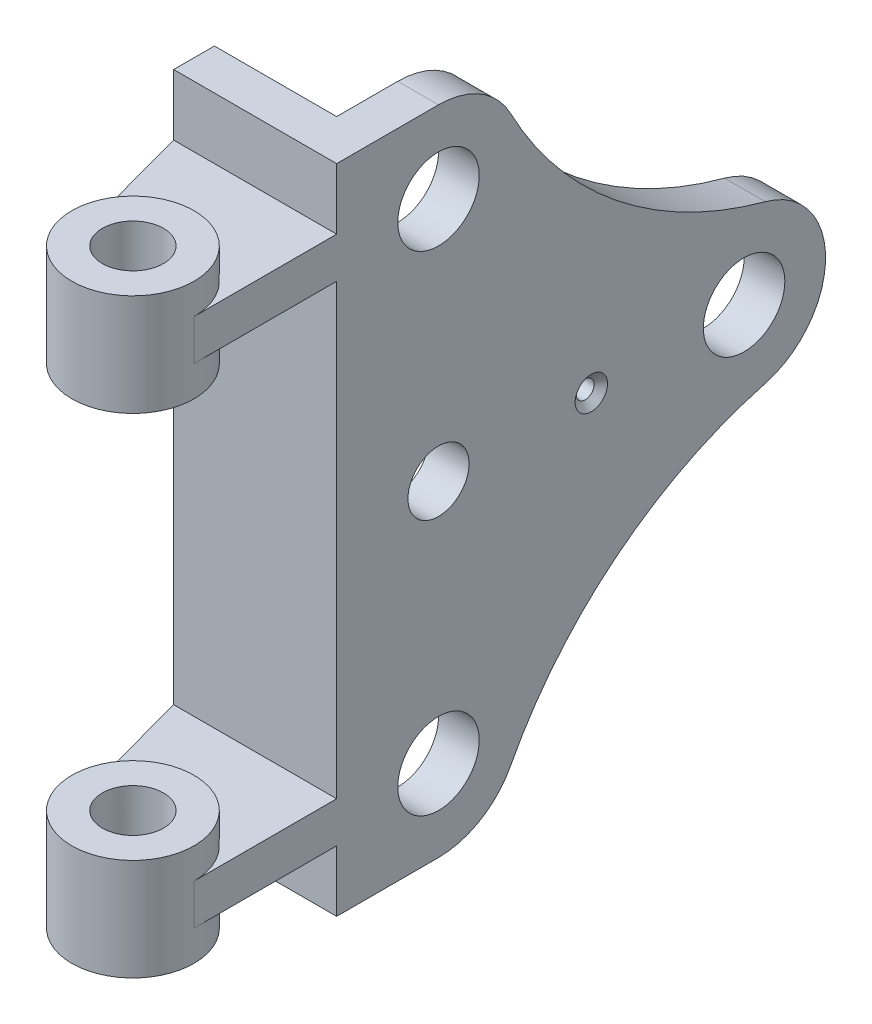
ISO-10303-21;
HEADER;
FILE_DESCRIPTION(('STEP AP214'),'2;1');
FILE_NAME('part.step','',(''),(''),'','','');
FILE_SCHEMA(('AUTOMOTIVE_DESIGN { 1 0 10303 214 1 1 1 1 }'));
ENDSEC;
DATA;
#1=APPLICATION_CONTEXT('core data for automotive mechanical design processes');
#2=APPLICATION_PROTOCOL_DEFINITION('international standard','automotive_design',2000,#1);
#3=PRODUCT_CONTEXT('',#1,'mechanical');
#4=PRODUCT('Part','Part','',(#3));
#5=PRODUCT_RELATED_PRODUCT_CATEGORY('part','',(#4));
#6=PRODUCT_DEFINITION_FORMATION('','',#4);
#7=PRODUCT_DEFINITION_CONTEXT('part definition',#1,'design');
#8=PRODUCT_DEFINITION('design','',#6,#7);
#9=PRODUCT_DEFINITION_SHAPE('','',#8);
#10=(LENGTH_UNIT() NAMED_UNIT(*) SI_UNIT(.MILLI.,.METRE.));
#11=(NAMED_UNIT(*) PLANE_ANGLE_UNIT() SI_UNIT($,.RADIAN.));
#12=(NAMED_UNIT(*) SI_UNIT($,.STERADIAN.) SOLID_ANGLE_UNIT());
#13=UNCERTAINTY_MEASURE_WITH_UNIT(LENGTH_MEASURE(1.E-05),#10,'distance_accuracy_value','');
#14=(GEOMETRIC_REPRESENTATION_CONTEXT(3) GLOBAL_UNCERTAINTY_ASSIGNED_CONTEXT((#13)) GLOBAL_UNIT_ASSIGNED_CONTEXT((#10,
#11,#12)) REPRESENTATION_CONTEXT('',''));
#15=CARTESIAN_POINT('',(0.,0.,0.));
#16=DIRECTION('',(0.,0.,1.));
#17=DIRECTION('',(1.,0.,0.));
#18=AXIS2_PLACEMENT_3D('',#15,#16,#17);
#19=CARTESIAN_POINT('',(-3.175,20.6375,22.225));
#20=DIRECTION('',(0.,-1.,0.));
#21=DIRECTION('',(0.,0.,1.));
#22=AXIS2_PLACEMENT_3D('',#19,#20,#21);
#23=PLANE('',#22);
#24=CARTESIAN_POINT('',(-3.175,20.6375,22.225));
#25=DIRECTION('',(0.,1.,0.));
#26=DIRECTION('',(0.,0.,1.));
#27=AXIS2_PLACEMENT_3D('',#24,#25,#26);
#28=CIRCLE('',#27,9.525);
#29=CARTESIAN_POINT('',(-3.175,20.6375,31.75));
#30=VERTEX_POINT('',#29);
#31=EDGE_CURVE('E183',#30,#30,#28,.T.);
#32=ORIENTED_EDGE('',*,*,#31,.T.);
#33=EDGE_LOOP('',(#32));
#34=FACE_BOUND('',#33,.T.);
#35=CARTESIAN_POINT('',(-3.175,20.6375,22.225));
#36=DIRECTION('',(0.,-1.,0.));
#37=DIRECTION('',(0.,0.,-1.));
#38=AXIS2_PLACEMENT_3D('',#35,#36,#37);
#39=CIRCLE('',#38,4.7625);
#40=CARTESIAN_POINT('',(-3.175,20.6375,17.4625));
#41=VERTEX_POINT('',#40);
#42=EDGE_CURVE('E180',#41,#41,#39,.F.);
#43=ORIENTED_EDGE('',*,*,#42,.F.);
#44=EDGE_LOOP('',(#43));
#45=FACE_BOUND('',#44,.T.);
#46=ADVANCED_FACE('F32',(#34,#45),#23,.F.);
#47=CARTESIAN_POINT('',(-3.175,4.7625,22.225));
#48=DIRECTION('',(0.,-1.,0.));
#49=DIRECTION('',(0.,0.,1.));
#50=AXIS2_PLACEMENT_3D('',#47,#48,#49);
#51=PLANE('',#50);
#52=CARTESIAN_POINT('',(-3.175,4.7625,22.225));
#53=DIRECTION('',(0.,1.,0.));
#54=DIRECTION('',(0.,0.,1.));
#55=AXIS2_PLACEMENT_3D('',#52,#53,#54);
#56=CIRCLE('',#55,9.525);
#57=CARTESIAN_POINT('',(-3.175,4.7625,31.75));
#58=VERTEX_POINT('',#57);
#59=EDGE_CURVE('E184',#58,#58,#56,.T.);
#60=ORIENTED_EDGE('',*,*,#59,.F.);
#61=EDGE_LOOP('',(#60));
#62=FACE_BOUND('',#61,.T.);
#63=CARTESIAN_POINT('',(-3.175,4.7625,22.225));
#64=DIRECTION('',(0.,1.,0.));
#65=DIRECTION('',(0.,0.,1.));
#66=AXIS2_PLACEMENT_3D('',#63,#64,#65);
#67=CIRCLE('',#66,4.7625);
#68=CARTESIAN_POINT('',(-3.175,4.7625,26.9875));
#69=VERTEX_POINT('',#68);
#70=EDGE_CURVE('E177',#69,#69,#67,.T.);
#71=ORIENTED_EDGE('',*,*,#70,.T.);
#72=EDGE_LOOP('',(#71));
#73=FACE_BOUND('',#72,.T.);
#74=ADVANCED_FACE('F439',(#62,#73),#51,.T.);
#75=CARTESIAN_POINT('',(6.35,0.,0.));
#76=DIRECTION('',(0.,0.,-1.));
#77=DIRECTION('',(-1.,0.,0.));
#78=AXIS2_PLACEMENT_3D('',#75,#76,#77);
#79=PLANE('',#78);
#80=DIRECTION('',(-1.,0.,0.));
#81=VECTOR('',#80,1.);
#82=CARTESIAN_POINT('',(-19.05,9.525,0.));
#83=LINE('',#82,#81);
#84=CARTESIAN_POINT('',(6.35,9.525,0.));
#85=VERTEX_POINT('',#84);
#86=CARTESIAN_POINT('',(-19.05,9.525,0.));
#87=VERTEX_POINT('',#86);
#88=EDGE_CURVE('E195',#85,#87,#83,.T.);
#89=ORIENTED_EDGE('',*,*,#88,.T.);
#90=DIRECTION('',(0.,-1.,0.));
#91=VECTOR('',#90,1.);
#92=CARTESIAN_POINT('',(-19.05,0.,0.));
#93=LINE('',#92,#91);
#94=CARTESIAN_POINT('',(-19.05,0.,0.));
#95=VERTEX_POINT('',#94);
#96=EDGE_CURVE('E270',#87,#95,#93,.T.);
#97=ORIENTED_EDGE('',*,*,#96,.T.);
#98=DIRECTION('',(-1.,0.,0.));
#99=VECTOR('',#98,1.);
#100=CARTESIAN_POINT('',(6.35,0.,0.));
#101=LINE('',#100,#99);
#102=CARTESIAN_POINT('',(6.35,0.,0.));
#103=VERTEX_POINT('',#102);
#104=EDGE_CURVE('E309',#103,#95,#101,.T.);
#105=ORIENTED_EDGE('',*,*,#104,.F.);
#106=DIRECTION('',(0.,-1.,0.));
#107=VECTOR('',#106,1.);
#108=CARTESIAN_POINT('',(6.35,0.,0.));
#109=LINE('',#108,#107);
#110=EDGE_CURVE('E47',#85,#103,#109,.T.);
#111=ORIENTED_EDGE('',*,*,#110,.F.);
#112=EDGE_LOOP('',(#89,#97,#105,#111));
#113=FACE_BOUND('',#112,.T.);
#114=ADVANCED_FACE('F445',(#113),#79,.F.);
#115=CARTESIAN_POINT('',(-3.175,92.075,22.225));
#116=DIRECTION('',(0.,-1.,0.));
#117=DIRECTION('',(0.,0.,-1.));
#118=AXIS2_PLACEMENT_3D('',#115,#116,#117);
#119=PLANE('',#118);
#120=CARTESIAN_POINT('',(-3.175,92.075,22.225));
#121=DIRECTION('',(0.,-1.,0.));
#122=DIRECTION('',(0.,0.,-1.));
#123=AXIS2_PLACEMENT_3D('',#120,#121,#122);
#124=CIRCLE('',#123,9.525);
#125=CARTESIAN_POINT('',(6.35,92.075,22.225));
#126=VERTEX_POINT('',#125);
#127=CARTESIAN_POINT('',(-12.3699464238893,92.075,24.7106760170638));
#128=VERTEX_POINT('',#127);
#129=EDGE_CURVE('E223',#126,#128,#124,.F.);
#130=ORIENTED_EDGE('',*,*,#129,.F.);
#131=DIRECTION('',(0.,0.,-1.));
#132=VECTOR('',#131,1.);
#133=CARTESIAN_POINT('',(6.35,92.075,0.));
#134=LINE('',#133,#132);
#135=CARTESIAN_POINT('',(6.35,92.075,0.));
#136=VERTEX_POINT('',#135);
#137=EDGE_CURVE('E239',#126,#136,#134,.T.);
#138=ORIENTED_EDGE('',*,*,#137,.T.);
#139=DIRECTION('',(-1.,0.,0.));
#140=VECTOR('',#139,1.);
#141=CARTESIAN_POINT('',(-19.05,92.075,0.));
#142=LINE('',#141,#140);
#143=CARTESIAN_POINT('',(-19.05,92.075,0.));
#144=VERTEX_POINT('',#143);
#145=EDGE_CURVE('E234',#136,#144,#142,.T.);
#146=ORIENTED_EDGE('',*,*,#145,.T.);
#147=DIRECTION('',(0.260963361371523,0.,0.965348705920133));
#148=VECTOR('',#147,1.);
#149=CARTESIAN_POINT('',(-12.3699464238893,92.075,24.7106760170638));
#150=LINE('',#149,#148);
#151=EDGE_CURVE('E248',#144,#128,#150,.T.);
#152=ORIENTED_EDGE('',*,*,#151,.T.);
#153=EDGE_LOOP('',(#130,#138,#146,#152));
#154=FACE_BOUND('',#153,.T.);
#155=ADVANCED_FACE('F413',(#154),#119,.F.);
#156=CARTESIAN_POINT('',(-3.175,85.725,22.225));
#157=DIRECTION('',(0.,-1.,0.));
#158=DIRECTION('',(0.,0.,-1.));
#159=AXIS2_PLACEMENT_3D('',#156,#157,#158);
#160=PLANE('',#159);
#161=DIRECTION('',(0.,0.,-1.));
#162=VECTOR('',#161,1.);
#163=CARTESIAN_POINT('',(6.35,85.725,0.));
#164=LINE('',#163,#162);
#165=CARTESIAN_POINT('',(6.35,85.725,22.225));
#166=VERTEX_POINT('',#165);
#167=CARTESIAN_POINT('',(6.35,85.725,0.));
#168=VERTEX_POINT('',#167);
#169=EDGE_CURVE('E258',#166,#168,#164,.T.);
#170=ORIENTED_EDGE('',*,*,#169,.F.);
#171=CARTESIAN_POINT('',(-3.175,85.725,22.225));
#172=DIRECTION('',(0.,-1.,0.));
#173=DIRECTION('',(0.,0.,-1.));
#174=AXIS2_PLACEMENT_3D('',#171,#172,#173);
#175=CIRCLE('',#174,9.525);
#176=CARTESIAN_POINT('',(-12.3699464238893,85.725,24.7106760170638));
#177=VERTEX_POINT('',#176);
#178=EDGE_CURVE('E40',#166,#177,#175,.F.);
#179=ORIENTED_EDGE('',*,*,#178,.T.);
#180=DIRECTION('',(0.260963361371523,0.,0.965348705920133));
#181=VECTOR('',#180,1.);
#182=CARTESIAN_POINT('',(-12.3699464238893,85.725,24.7106760170638));
#183=LINE('',#182,#181);
#184=CARTESIAN_POINT('',(-19.05,85.7249999999999,0.));
#185=VERTEX_POINT('',#184);
#186=EDGE_CURVE('E228',#185,#177,#183,.T.);
#187=ORIENTED_EDGE('',*,*,#186,.F.);
#188=DIRECTION('',(-1.,0.,0.));
#189=VECTOR('',#188,1.);
#190=CARTESIAN_POINT('',(-19.05,85.725,0.));
#191=LINE('',#190,#189);
#192=EDGE_CURVE('E251',#168,#185,#191,.T.);
#193=ORIENTED_EDGE('',*,*,#192,.F.);
#194=EDGE_LOOP('',(#170,#179,#187,#193));
#195=FACE_BOUND('',#194,.T.);
#196=ADVANCED_FACE('F401',(#195),#160,.T.);
#197=ORIENTED_EDGE('',*,*,#145,.F.);
#198=CARTESIAN_POINT('',(6.35,101.6,0.));
#199=VERTEX_POINT('',#198);
#200=EDGE_CURVE('E312',#199,#136,#109,.T.);
#201=ORIENTED_EDGE('',*,*,#200,.F.);
#202=DIRECTION('',(-1.,0.,0.));
#203=VECTOR('',#202,1.);
#204=CARTESIAN_POINT('',(6.35,101.6,0.));
#205=LINE('',#204,#203);
#206=CARTESIAN_POINT('',(-19.05,101.6,0.));
#207=VERTEX_POINT('',#206);
#208=EDGE_CURVE('E307',#199,#207,#205,.T.);
#209=ORIENTED_EDGE('',*,*,#208,.T.);
#210=EDGE_CURVE('E285',#207,#144,#93,.T.);
#211=ORIENTED_EDGE('',*,*,#210,.T.);
#212=EDGE_LOOP('',(#197,#201,#209,#211));
#213=FACE_BOUND('',#212,.T.);
#214=ADVANCED_FACE('F502',(#213),#79,.F.);
#215=CARTESIAN_POINT('',(0.,12.7,-15.875));
#216=DIRECTION('',(1.,0.,0.));
#217=DIRECTION('',(0.,0.,-1.));
#218=AXIS2_PLACEMENT_3D('',#215,#216,#217);
#219=PLANE('',#218);
#220=CARTESIAN_POINT('',(0.,50.8,-63.5));
#221=DIRECTION('',(1.,0.,0.));
#222=DIRECTION('',(0.,0.,-1.));
#223=AXIS2_PLACEMENT_3D('',#220,#221,#222);
#224=CIRCLE('',#223,6.35);
#225=CARTESIAN_POINT('',(0.,50.8,-69.85));
#226=VERTEX_POINT('',#225);
#227=EDGE_CURVE('E328',#226,#226,#224,.T.);
#228=ORIENTED_EDGE('',*,*,#227,.T.);
#229=EDGE_LOOP('',(#228));
#230=FACE_BOUND('',#229,.T.);
#231=CARTESIAN_POINT('',(0.,88.9,-15.875));
#232=DIRECTION('',(1.,0.,0.));
#233=DIRECTION('',(0.,0.,-1.));
#234=AXIS2_PLACEMENT_3D('',#231,#232,#233);
#235=CIRCLE('',#234,6.35);
#236=CARTESIAN_POINT('',(0.,88.9,-22.225));
#237=VERTEX_POINT('',#236);
#238=EDGE_CURVE('E357',#237,#237,#235,.T.);
#239=ORIENTED_EDGE('',*,*,#238,.T.);
#240=EDGE_LOOP('',(#239));
#241=FACE_BOUND('',#240,.T.);
#242=CARTESIAN_POINT('',(0.,12.7,-15.875));
#243=DIRECTION('',(1.,0.,0.));
#244=DIRECTION('',(0.,0.,-1.));
#245=AXIS2_PLACEMENT_3D('',#242,#243,#244);
#246=CIRCLE('',#245,6.35);
#247=CARTESIAN_POINT('',(0.,12.7,-22.225));
#248=VERTEX_POINT('',#247);
#249=EDGE_CURVE('E363',#248,#248,#246,.T.);
#250=ORIENTED_EDGE('',*,*,#249,.T.);
#251=EDGE_LOOP('',(#250));
#252=FACE_BOUND('',#251,.T.);
#253=CARTESIAN_POINT('',(0.,50.8,-15.875));
#254=DIRECTION('',(1.,0.,0.));
#255=DIRECTION('',(0.,0.,-1.));
#256=AXIS2_PLACEMENT_3D('',#253,#254,#255);
#257=CIRCLE('',#256,4.7625);
#258=CARTESIAN_POINT('',(0.,50.8,-20.6375));
#259=VERTEX_POINT('',#258);
#260=EDGE_CURVE('E369',#259,#259,#257,.T.);
#261=ORIENTED_EDGE('',*,*,#260,.T.);
#262=EDGE_LOOP('',(#261));
#263=FACE_BOUND('',#262,.T.);
#264=DIRECTION('',(0.,-1.,0.));
#265=VECTOR('',#264,1.);
#266=CARTESIAN_POINT('',(0.,12.7,-6.35));
#267=LINE('',#266,#265);
#268=CARTESIAN_POINT('',(0.,101.6,-6.35));
#269=VERTEX_POINT('',#268);
#270=CARTESIAN_POINT('',(0.,0.,-6.35));
#271=VERTEX_POINT('',#270);
#272=EDGE_CURVE('E269',#269,#271,#267,.T.);
#273=ORIENTED_EDGE('',*,*,#272,.F.);
#274=DIRECTION('',(0.,0.,1.));
#275=VECTOR('',#274,1.);
#276=CARTESIAN_POINT('',(0.,101.6,0.));
#277=LINE('',#276,#275);
#278=CARTESIAN_POINT('',(0.,101.6,-15.875));
#279=VERTEX_POINT('',#278);
#280=EDGE_CURVE('E313',#279,#269,#277,.T.);
#281=ORIENTED_EDGE('',*,*,#280,.F.);
#282=CARTESIAN_POINT('',(0.,88.9,-15.875));
#283=DIRECTION('',(1.,0.,0.));
#284=DIRECTION('',(0.,0.,1.));
#285=AXIS2_PLACEMENT_3D('',#282,#283,#284);
#286=CIRCLE('',#285,12.7);
#287=CARTESIAN_POINT('',(0.,94.8132663040378,-27.1143630432303));
#288=VERTEX_POINT('',#287);
#289=EDGE_CURVE('E317',#288,#279,#286,.T.);
#290=ORIENTED_EDGE('',*,*,#289,.F.);
#291=CARTESIAN_POINT('',(0.,124.379597824227,-83.3111782593817));
#292=DIRECTION('',(-1.,0.,0.));
#293=DIRECTION('',(0.,0.,-1.));
#294=AXIS2_PLACEMENT_3D('',#291,#292,#293);
#295=CIRCLE('',#294,63.5);
#296=CARTESIAN_POINT('',(0.,63.0632663040379,-66.8018630432303));
#297=VERTEX_POINT('',#296);
#298=EDGE_CURVE('E319',#297,#288,#295,.T.);
#299=ORIENTED_EDGE('',*,*,#298,.F.);
#300=CARTESIAN_POINT('',(0.,50.8,-63.5));
#301=DIRECTION('',(1.,0.,0.));
#302=DIRECTION('',(0.,0.,1.));
#303=AXIS2_PLACEMENT_3D('',#300,#301,#302);
#304=CIRCLE('',#303,12.7);
#305=CARTESIAN_POINT('',(0.,38.5367336959622,-66.8018630432303));
#306=VERTEX_POINT('',#305);
#307=EDGE_CURVE('E321',#306,#297,#304,.T.);
#308=ORIENTED_EDGE('',*,*,#307,.F.);
#309=CARTESIAN_POINT('',(0.,-22.7795978242271,-83.3111782593817));
#310=DIRECTION('',(-1.,0.,0.));
#311=DIRECTION('',(0.,0.,1.));
#312=AXIS2_PLACEMENT_3D('',#309,#310,#311);
#313=CIRCLE('',#312,63.5);
#314=CARTESIAN_POINT('',(0.,6.78673369596215,-27.1143630432303));
#315=VERTEX_POINT('',#314);
#316=EDGE_CURVE('E323',#315,#306,#313,.T.);
#317=ORIENTED_EDGE('',*,*,#316,.F.);
#318=CARTESIAN_POINT('',(0.,12.7,-15.875));
#319=DIRECTION('',(1.,0.,0.));
#320=DIRECTION('',(0.,0.,-1.));
#321=AXIS2_PLACEMENT_3D('',#318,#319,#320);
#322=CIRCLE('',#321,12.7);
#323=CARTESIAN_POINT('',(0.,0.,-15.875));
#324=VERTEX_POINT('',#323);
#325=EDGE_CURVE('E325',#324,#315,#322,.T.);
#326=ORIENTED_EDGE('',*,*,#325,.F.);
#327=DIRECTION('',(0.,0.,-1.));
#328=VECTOR('',#327,1.);
#329=CARTESIAN_POINT('',(0.,0.,0.));
#330=LINE('',#329,#328);
#331=EDGE_CURVE('E327',#271,#324,#330,.T.);
#332=ORIENTED_EDGE('',*,*,#331,.F.);
#333=EDGE_LOOP('',(#273,#281,#290,#299,#308,#317,#326,#332));
#334=FACE_BOUND('',#333,.T.);
#335=ADVANCED_FACE('F507',(#230,#241,#252,#263,#334),#219,.F.);
#336=CARTESIAN_POINT('',(6.35,0.,0.));
#337=DIRECTION('',(0.,1.,0.));
#338=DIRECTION('',(0.,0.,1.));
#339=AXIS2_PLACEMENT_3D('',#336,#337,#338);
#340=PLANE('',#339);
#341=ORIENTED_EDGE('',*,*,#104,.T.);
#342=DIRECTION('',(0.,0.,1.));
#343=VECTOR('',#342,1.);
#344=CARTESIAN_POINT('',(-19.05,0.,-6.35));
#345=LINE('',#344,#343);
#346=CARTESIAN_POINT('',(-19.05,0.,-6.35));
#347=VERTEX_POINT('',#346);
#348=EDGE_CURVE('E279',#347,#95,#345,.T.);
#349=ORIENTED_EDGE('',*,*,#348,.F.);
#350=DIRECTION('',(1.,0.,0.));
#351=VECTOR('',#350,1.);
#352=CARTESIAN_POINT('',(6.35,0.,-6.35));
#353=LINE('',#352,#351);
#354=EDGE_CURVE('E277',#347,#271,#353,.T.);
#355=ORIENTED_EDGE('',*,*,#354,.T.);
#356=ORIENTED_EDGE('',*,*,#331,.T.);
#357=DIRECTION('',(-1.,0.,0.));
#358=VECTOR('',#357,1.);
#359=CARTESIAN_POINT('',(6.35,0.,-15.875));
#360=LINE('',#359,#358);
#361=CARTESIAN_POINT('',(6.35,0.,-15.875));
#362=VERTEX_POINT('',#361);
#363=EDGE_CURVE('E289',#362,#324,#360,.T.);
#364=ORIENTED_EDGE('',*,*,#363,.F.);
#365=DIRECTION('',(0.,0.,-1.));
#366=VECTOR('',#365,1.);
#367=CARTESIAN_POINT('',(6.35,0.,0.));
#368=LINE('',#367,#366);
#369=EDGE_CURVE('E316',#103,#362,#368,.T.);
#370=ORIENTED_EDGE('',*,*,#369,.F.);
#371=EDGE_LOOP('',(#341,#349,#355,#356,#364,#370));
#372=FACE_BOUND('',#371,.T.);
#373=ADVANCED_FACE('F34',(#372),#340,.F.);
#374=CARTESIAN_POINT('',(6.35,12.7,-15.875));
#375=DIRECTION('',(-1.,0.,0.));
#376=DIRECTION('',(0.,0.,1.));
#377=AXIS2_PLACEMENT_3D('',#374,#375,#376);
#378=CYLINDRICAL_SURFACE('',#377,12.7);
#379=ORIENTED_EDGE('',*,*,#325,.T.);
#380=DIRECTION('',(-1.,0.,0.));
#381=VECTOR('',#380,1.);
#382=CARTESIAN_POINT('',(6.35,6.78673369596215,-27.1143630432303));
#383=LINE('',#382,#381);
#384=CARTESIAN_POINT('',(6.35,6.78673369596215,-27.1143630432303));
#385=VERTEX_POINT('',#384);
#386=EDGE_CURVE('E292',#385,#315,#383,.T.);
#387=ORIENTED_EDGE('',*,*,#386,.F.);
#388=CARTESIAN_POINT('',(6.35,12.7,-15.875));
#389=DIRECTION('',(1.,0.,0.));
#390=DIRECTION('',(0.,0.,-1.));
#391=AXIS2_PLACEMENT_3D('',#388,#389,#390);
#392=CIRCLE('',#391,12.7);
#393=EDGE_CURVE('E351',#362,#385,#392,.T.);
#394=ORIENTED_EDGE('',*,*,#393,.F.);
#395=ORIENTED_EDGE('',*,*,#363,.T.);
#396=EDGE_LOOP('',(#379,#387,#394,#395));
#397=FACE_BOUND('',#396,.T.);
#398=ADVANCED_FACE('F479',(#397),#378,.T.);
#399=CARTESIAN_POINT('',(6.35,-22.7795978242271,-83.3111782593817));
#400=DIRECTION('',(-1.,0.,0.));
#401=DIRECTION('',(0.,0.,1.));
#402=AXIS2_PLACEMENT_3D('',#399,#400,#401);
#403=CYLINDRICAL_SURFACE('',#402,63.5);
#404=ORIENTED_EDGE('',*,*,#316,.T.);
#405=DIRECTION('',(-1.,0.,0.));
#406=VECTOR('',#405,1.);
#407=CARTESIAN_POINT('',(6.35,38.5367336959622,-66.8018630432303));
#408=LINE('',#407,#406);
#409=CARTESIAN_POINT('',(6.35,38.5367336959622,-66.8018630432303));
#410=VERTEX_POINT('',#409);
#411=EDGE_CURVE('E295',#410,#306,#408,.T.);
#412=ORIENTED_EDGE('',*,*,#411,.F.);
#413=CARTESIAN_POINT('',(6.35,-22.7795978242271,-83.3111782593817));
#414=DIRECTION('',(-1.,0.,0.));
#415=DIRECTION('',(0.,0.,1.));
#416=AXIS2_PLACEMENT_3D('',#413,#414,#415);
#417=CIRCLE('',#416,63.5);
#418=EDGE_CURVE('E349',#385,#410,#417,.T.);
#419=ORIENTED_EDGE('',*,*,#418,.F.);
#420=ORIENTED_EDGE('',*,*,#386,.T.);
#421=EDGE_LOOP('',(#404,#412,#419,#420));
#422=FACE_BOUND('',#421,.T.);
#423=ADVANCED_FACE('F485',(#422),#403,.F.);
#424=CARTESIAN_POINT('',(6.35,50.8,-63.5));
#425=DIRECTION('',(-1.,0.,0.));
#426=DIRECTION('',(0.,0.,1.));
#427=AXIS2_PLACEMENT_3D('',#424,#425,#426);
#428=CYLINDRICAL_SURFACE('',#427,12.7);
#429=ORIENTED_EDGE('',*,*,#307,.T.);
#430=DIRECTION('',(-1.,0.,0.));
#431=VECTOR('',#430,1.);
#432=CARTESIAN_POINT('',(6.35,63.0632663040379,-66.8018630432303));
#433=LINE('',#432,#431);
#434=CARTESIAN_POINT('',(6.35,63.0632663040379,-66.8018630432303));
#435=VERTEX_POINT('',#434);
#436=EDGE_CURVE('E298',#435,#297,#433,.T.);
#437=ORIENTED_EDGE('',*,*,#436,.F.);
#438=CARTESIAN_POINT('',(6.35,50.8,-63.5));
#439=DIRECTION('',(1.,0.,0.));
#440=DIRECTION('',(0.,0.,1.));
#441=AXIS2_PLACEMENT_3D('',#438,#439,#440);
#442=CIRCLE('',#441,12.7);
#443=EDGE_CURVE('E345',#410,#435,#442,.T.);
#444=ORIENTED_EDGE('',*,*,#443,.F.);
#445=ORIENTED_EDGE('',*,*,#411,.T.);
#446=EDGE_LOOP('',(#429,#437,#444,#445));
#447=FACE_BOUND('',#446,.T.);
#448=ADVANCED_FACE('F491',(#447),#428,.T.);
#449=CARTESIAN_POINT('',(6.35,124.379597824227,-83.3111782593817));
#450=DIRECTION('',(-1.,0.,0.));
#451=DIRECTION('',(0.,0.,1.));
#452=AXIS2_PLACEMENT_3D('',#449,#450,#451);
#453=CYLINDRICAL_SURFACE('',#452,63.5);
#454=ORIENTED_EDGE('',*,*,#298,.T.);
#455=DIRECTION('',(-1.,0.,0.));
#456=VECTOR('',#455,1.);
#457=CARTESIAN_POINT('',(6.35,94.8132663040378,-27.1143630432303));
#458=LINE('',#457,#456);
#459=CARTESIAN_POINT('',(6.35,94.8132663040378,-27.1143630432303));
#460=VERTEX_POINT('',#459);
#461=EDGE_CURVE('E301',#460,#288,#458,.T.);
#462=ORIENTED_EDGE('',*,*,#461,.F.);
#463=CARTESIAN_POINT('',(6.35,124.379597824227,-83.3111782593817));
#464=DIRECTION('',(-1.,0.,0.));
#465=DIRECTION('',(0.,0.,-1.));
#466=AXIS2_PLACEMENT_3D('',#463,#464,#465);
#467=CIRCLE('',#466,63.5);
#468=EDGE_CURVE('E342',#435,#460,#467,.T.);
#469=ORIENTED_EDGE('',*,*,#468,.F.);
#470=ORIENTED_EDGE('',*,*,#436,.T.);
#471=EDGE_LOOP('',(#454,#462,#469,#470));
#472=FACE_BOUND('',#471,.T.);
#473=ADVANCED_FACE('F495',(#472),#453,.F.);
#474=CARTESIAN_POINT('',(6.35,88.9,-15.875));
#475=DIRECTION('',(-1.,0.,0.));
#476=DIRECTION('',(0.,0.,1.));
#477=AXIS2_PLACEMENT_3D('',#474,#475,#476);
#478=CYLINDRICAL_SURFACE('',#477,12.7);
#479=ORIENTED_EDGE('',*,*,#289,.T.);
#480=DIRECTION('',(-1.,0.,0.));
#481=VECTOR('',#480,1.);
#482=CARTESIAN_POINT('',(6.35,101.6,-15.875));
#483=LINE('',#482,#481);
#484=CARTESIAN_POINT('',(6.35,101.6,-15.875));
#485=VERTEX_POINT('',#484);
#486=EDGE_CURVE('E304',#485,#279,#483,.T.);
#487=ORIENTED_EDGE('',*,*,#486,.F.);
#488=CARTESIAN_POINT('',(6.35,88.9,-15.875));
#489=DIRECTION('',(1.,0.,0.));
#490=DIRECTION('',(0.,0.,1.));
#491=AXIS2_PLACEMENT_3D('',#488,#489,#490);
#492=CIRCLE('',#491,12.7);
#493=EDGE_CURVE('E339',#460,#485,#492,.T.);
#494=ORIENTED_EDGE('',*,*,#493,.F.);
#495=ORIENTED_EDGE('',*,*,#461,.T.);
#496=EDGE_LOOP('',(#479,#487,#494,#495));
#497=FACE_BOUND('',#496,.T.);
#498=ADVANCED_FACE('F498',(#497),#478,.T.);
#499=CARTESIAN_POINT('',(6.35,101.6,0.));
#500=DIRECTION('',(0.,-1.,0.));
#501=DIRECTION('',(0.,0.,-1.));
#502=AXIS2_PLACEMENT_3D('',#499,#500,#501);
#503=PLANE('',#502);
#504=ORIENTED_EDGE('',*,*,#208,.F.);
#505=DIRECTION('',(0.,0.,1.));
#506=VECTOR('',#505,1.);
#507=CARTESIAN_POINT('',(6.35,101.6,0.));
#508=LINE('',#507,#506);
#509=EDGE_CURVE('E331',#485,#199,#508,.T.);
#510=ORIENTED_EDGE('',*,*,#509,.F.);
#511=ORIENTED_EDGE('',*,*,#486,.T.);
#512=ORIENTED_EDGE('',*,*,#280,.T.);
#513=DIRECTION('',(-1.,0.,0.));
#514=VECTOR('',#513,1.);
#515=CARTESIAN_POINT('',(6.35,101.6,-6.35));
#516=LINE('',#515,#514);
#517=CARTESIAN_POINT('',(-19.05,101.6,-6.35));
#518=VERTEX_POINT('',#517);
#519=EDGE_CURVE('E287',#269,#518,#516,.T.);
#520=ORIENTED_EDGE('',*,*,#519,.T.);
#521=DIRECTION('',(0.,0.,1.));
#522=VECTOR('',#521,1.);
#523=CARTESIAN_POINT('',(-19.05,101.6,-6.35));
#524=LINE('',#523,#522);
#525=EDGE_CURVE('E376',#518,#207,#524,.T.);
#526=ORIENTED_EDGE('',*,*,#525,.T.);
#527=EDGE_LOOP('',(#504,#510,#511,#512,#520,#526));
#528=FACE_BOUND('',#527,.T.);
#529=ADVANCED_FACE('F500',(#528),#503,.F.);
#530=CARTESIAN_POINT('',(-19.05,15.875,0.));
#531=VERTEX_POINT('',#530);
#532=EDGE_CURVE('E272',#185,#531,#93,.T.);
#533=ORIENTED_EDGE('',*,*,#532,.T.);
#534=DIRECTION('',(-1.,0.,0.));
#535=VECTOR('',#534,1.);
#536=CARTESIAN_POINT('',(-19.05,15.875,0.));
#537=LINE('',#536,#535);
#538=CARTESIAN_POINT('',(6.35,15.875,0.));
#539=VERTEX_POINT('',#538);
#540=EDGE_CURVE('E55',#539,#531,#537,.T.);
#541=ORIENTED_EDGE('',*,*,#540,.F.);
#542=EDGE_CURVE('E240',#168,#539,#109,.T.);
#543=ORIENTED_EDGE('',*,*,#542,.F.);
#544=ORIENTED_EDGE('',*,*,#192,.T.);
#545=EDGE_LOOP('',(#533,#541,#543,#544));
#546=FACE_BOUND('',#545,.T.);
#547=ADVANCED_FACE('F404',(#546),#79,.F.);
#548=CARTESIAN_POINT('',(6.35,12.7,-15.875));
#549=DIRECTION('',(1.,0.,0.));
#550=DIRECTION('',(0.,0.,-1.));
#551=AXIS2_PLACEMENT_3D('',#548,#549,#550);
#552=PLANE('',#551);
#553=CARTESIAN_POINT('',(6.35,50.8,-39.6875));
#554=DIRECTION('',(1.,0.,0.));
#555=DIRECTION('',(0.,0.,-1.));
#556=AXIS2_PLACEMENT_3D('',#553,#554,#555);
#557=CIRCLE('',#556,2.5273);
#558=CARTESIAN_POINT('',(6.35,50.8,-42.2148));
#559=VERTEX_POINT('',#558);
#560=EDGE_CURVE('E172',#559,#559,#557,.T.);
#561=ORIENTED_EDGE('',*,*,#560,.F.);
#562=EDGE_LOOP('',(#561));
#563=FACE_BOUND('',#562,.T.);
#564=ORIENTED_EDGE('',*,*,#369,.T.);
#565=ORIENTED_EDGE('',*,*,#393,.T.);
#566=ORIENTED_EDGE('',*,*,#418,.T.);
#567=ORIENTED_EDGE('',*,*,#443,.T.);
#568=ORIENTED_EDGE('',*,*,#468,.T.);
#569=ORIENTED_EDGE('',*,*,#493,.T.);
#570=ORIENTED_EDGE('',*,*,#509,.T.);
#571=ORIENTED_EDGE('',*,*,#200,.T.);
#572=ORIENTED_EDGE('',*,*,#137,.F.);
#573=DIRECTION('',(0.,-1.,0.));
#574=VECTOR('',#573,1.);
#575=CARTESIAN_POINT('',(6.35,92.075,22.225));
#576=LINE('',#575,#574);
#577=EDGE_CURVE('E245',#126,#166,#576,.T.);
#578=ORIENTED_EDGE('',*,*,#577,.T.);
#579=ORIENTED_EDGE('',*,*,#169,.T.);
#580=ORIENTED_EDGE('',*,*,#542,.T.);
#581=DIRECTION('',(0.,0.,-1.));
#582=VECTOR('',#581,1.);
#583=CARTESIAN_POINT('',(6.35,15.875,0.));
#584=LINE('',#583,#582);
#585=CARTESIAN_POINT('',(6.35000000000001,15.875,22.225));
#586=VERTEX_POINT('',#585);
#587=EDGE_CURVE('E196',#586,#539,#584,.T.);
#588=ORIENTED_EDGE('',*,*,#587,.F.);
#589=DIRECTION('',(0.,1.,0.));
#590=VECTOR('',#589,1.);
#591=CARTESIAN_POINT('',(6.35,9.525,22.225));
#592=LINE('',#591,#590);
#593=CARTESIAN_POINT('',(6.35,9.525,22.225));
#594=VERTEX_POINT('',#593);
#595=EDGE_CURVE('E208',#594,#586,#592,.T.);
#596=ORIENTED_EDGE('',*,*,#595,.F.);
#597=DIRECTION('',(0.,0.,-1.));
#598=VECTOR('',#597,1.);
#599=CARTESIAN_POINT('',(6.35,9.525,0.));
#600=LINE('',#599,#598);
#601=EDGE_CURVE('E198',#594,#85,#600,.T.);
#602=ORIENTED_EDGE('',*,*,#601,.T.);
#603=ORIENTED_EDGE('',*,*,#110,.T.);
#604=EDGE_LOOP('',(#564,#565,#566,#567,#568,#569,#570,#571,#572,#578,#579,#580,#588,#596,#602,#603));
#605=FACE_BOUND('',#604,.T.);
#606=CARTESIAN_POINT('',(6.35,50.8,-63.5));
#607=DIRECTION('',(1.,0.,0.));
#608=DIRECTION('',(0.,0.,-1.));
#609=AXIS2_PLACEMENT_3D('',#606,#607,#608);
#610=CIRCLE('',#609,6.35);
#611=CARTESIAN_POINT('',(6.35,50.8,-69.85));
#612=VERTEX_POINT('',#611);
#613=EDGE_CURVE('E354',#612,#612,#610,.T.);
#614=ORIENTED_EDGE('',*,*,#613,.F.);
#615=EDGE_LOOP('',(#614));
#616=FACE_BOUND('',#615,.T.);
#617=CARTESIAN_POINT('',(6.35,88.9,-15.875));
#618=DIRECTION('',(1.,0.,0.));
#619=DIRECTION('',(0.,0.,-1.));
#620=AXIS2_PLACEMENT_3D('',#617,#618,#619);
#621=CIRCLE('',#620,6.35);
#622=CARTESIAN_POINT('',(6.35,88.9,-22.225));
#623=VERTEX_POINT('',#622);
#624=EDGE_CURVE('E360',#623,#623,#621,.T.);
#625=ORIENTED_EDGE('',*,*,#624,.F.);
#626=EDGE_LOOP('',(#625));
#627=FACE_BOUND('',#626,.T.);
#628=CARTESIAN_POINT('',(6.35,12.7,-15.875));
#629=DIRECTION('',(1.,0.,0.));
#630=DIRECTION('',(0.,0.,-1.));
#631=AXIS2_PLACEMENT_3D('',#628,#629,#630);
#632=CIRCLE('',#631,6.35);
#633=CARTESIAN_POINT('',(6.35,12.7,-22.225));
#634=VERTEX_POINT('',#633);
#635=EDGE_CURVE('E366',#634,#634,#632,.T.);
#636=ORIENTED_EDGE('',*,*,#635,.F.);
#637=EDGE_LOOP('',(#636));
#638=FACE_BOUND('',#637,.T.);
#639=CARTESIAN_POINT('',(6.35,50.8,-15.875));
#640=DIRECTION('',(1.,0.,0.));
#641=DIRECTION('',(0.,0.,-1.));
#642=AXIS2_PLACEMENT_3D('',#639,#640,#641);
#643=CIRCLE('',#642,4.7625);
#644=CARTESIAN_POINT('',(6.35,50.8,-20.6375));
#645=VERTEX_POINT('',#644);
#646=EDGE_CURVE('E372',#645,#645,#643,.T.);
#647=ORIENTED_EDGE('',*,*,#646,.F.);
#648=EDGE_LOOP('',(#647));
#649=FACE_BOUND('',#648,.T.);
#650=ADVANCED_FACE('F396',(#563,#605,#616,#627,#638,#649),#552,.T.);
#651=CARTESIAN_POINT('',(0.,50.8,-63.5));
#652=DIRECTION('',(1.,0.,0.));
#653=DIRECTION('',(0.,0.,-1.));
#654=AXIS2_PLACEMENT_3D('',#651,#652,#653);
#655=CYLINDRICAL_SURFACE('',#654,6.35);
#656=ORIENTED_EDGE('',*,*,#227,.F.);
#657=EDGE_LOOP('',(#656));
#658=FACE_BOUND('',#657,.T.);
#659=ORIENTED_EDGE('',*,*,#613,.T.);
#660=EDGE_LOOP('',(#659));
#661=FACE_BOUND('',#660,.T.);
#662=ADVANCED_FACE('F569',(#658,#661),#655,.F.);
#663=CARTESIAN_POINT('',(0.,88.9,-15.875));
#664=DIRECTION('',(1.,0.,0.));
#665=DIRECTION('',(0.,0.,-1.));
#666=AXIS2_PLACEMENT_3D('',#663,#664,#665);
#667=CYLINDRICAL_SURFACE('',#666,6.35);
#668=ORIENTED_EDGE('',*,*,#238,.F.);
#669=EDGE_LOOP('',(#668));
#670=FACE_BOUND('',#669,.T.);
#671=ORIENTED_EDGE('',*,*,#624,.T.);
#672=EDGE_LOOP('',(#671));
#673=FACE_BOUND('',#672,.T.);
#674=ADVANCED_FACE('F577',(#670,#673),#667,.F.);
#675=CARTESIAN_POINT('',(0.,12.7,-15.875));
#676=DIRECTION('',(1.,0.,0.));
#677=DIRECTION('',(0.,0.,-1.));
#678=AXIS2_PLACEMENT_3D('',#675,#676,#677);
#679=CYLINDRICAL_SURFACE('',#678,6.35);
#680=ORIENTED_EDGE('',*,*,#249,.F.);
#681=EDGE_LOOP('',(#680));
#682=FACE_BOUND('',#681,.T.);
#683=ORIENTED_EDGE('',*,*,#635,.T.);
#684=EDGE_LOOP('',(#683));
#685=FACE_BOUND('',#684,.T.);
#686=ADVANCED_FACE('F584',(#682,#685),#679,.F.);
#687=CARTESIAN_POINT('',(0.,50.8,-15.875));
#688=DIRECTION('',(1.,0.,0.));
#689=DIRECTION('',(0.,0.,-1.));
#690=AXIS2_PLACEMENT_3D('',#687,#688,#689);
#691=CYLINDRICAL_SURFACE('',#690,4.7625);
#692=ORIENTED_EDGE('',*,*,#260,.F.);
#693=EDGE_LOOP('',(#692));
#694=FACE_BOUND('',#693,.T.);
#695=ORIENTED_EDGE('',*,*,#646,.T.);
#696=EDGE_LOOP('',(#695));
#697=FACE_BOUND('',#696,.T.);
#698=ADVANCED_FACE('F592',(#694,#697),#691,.F.);
#699=CARTESIAN_POINT('',(6.35,0.,-6.35));
#700=DIRECTION('',(0.,0.,1.));
#701=DIRECTION('',(1.,0.,0.));
#702=AXIS2_PLACEMENT_3D('',#699,#700,#701);
#703=PLANE('',#702);
#704=ORIENTED_EDGE('',*,*,#519,.F.);
#705=ORIENTED_EDGE('',*,*,#272,.T.);
#706=ORIENTED_EDGE('',*,*,#354,.F.);
#707=DIRECTION('',(0.,-1.,0.));
#708=VECTOR('',#707,1.);
#709=CARTESIAN_POINT('',(-19.05,0.,-6.35));
#710=LINE('',#709,#708);
#711=EDGE_CURVE('E383',#518,#347,#710,.T.);
#712=ORIENTED_EDGE('',*,*,#711,.F.);
#713=EDGE_LOOP('',(#704,#705,#706,#712));
#714=FACE_BOUND('',#713,.T.);
#715=ADVANCED_FACE('F504',(#714),#703,.F.);
#716=CARTESIAN_POINT('',(-19.05,0.,-6.35));
#717=DIRECTION('',(-1.,0.,0.));
#718=DIRECTION('',(0.,0.,1.));
#719=AXIS2_PLACEMENT_3D('',#716,#717,#718);
#720=PLANE('',#719);
#721=ORIENTED_EDGE('',*,*,#210,.F.);
#722=ORIENTED_EDGE('',*,*,#525,.F.);
#723=ORIENTED_EDGE('',*,*,#711,.T.);
#724=ORIENTED_EDGE('',*,*,#348,.T.);
#725=ORIENTED_EDGE('',*,*,#96,.F.);
#726=DIRECTION('',(0.,1.,0.));
#727=VECTOR('',#726,1.);
#728=CARTESIAN_POINT('',(-19.05,9.525,0.));
#729=LINE('',#728,#727);
#730=EDGE_CURVE('E211',#87,#531,#729,.T.);
#731=ORIENTED_EDGE('',*,*,#730,.T.);
#732=ORIENTED_EDGE('',*,*,#532,.F.);
#733=DIRECTION('',(0.,-1.,0.));
#734=VECTOR('',#733,1.);
#735=CARTESIAN_POINT('',(-19.05,92.075,0.));
#736=LINE('',#735,#734);
#737=EDGE_CURVE('E238',#144,#185,#736,.T.);
#738=ORIENTED_EDGE('',*,*,#737,.F.);
#739=EDGE_LOOP('',(#721,#722,#723,#724,#725,#731,#732,#738));
#740=FACE_BOUND('',#739,.T.);
#741=ADVANCED_FACE('F407',(#740),#720,.T.);
#742=CARTESIAN_POINT('',(-12.3699464238893,92.075,24.7106760170638));
#743=DIRECTION('',(0.965348705920133,0.,-0.260963361371523));
#744=DIRECTION('',(-0.260963361371523,0.,-0.965348705920133));
#745=AXIS2_PLACEMENT_3D('',#742,#743,#744);
#746=PLANE('',#745);
#747=ORIENTED_EDGE('',*,*,#186,.T.);
#748=DIRECTION('',(0.,-1.,0.));
#749=VECTOR('',#748,1.);
#750=CARTESIAN_POINT('',(-12.3699464238893,92.075,24.7106760170638));
#751=LINE('',#750,#749);
#752=EDGE_CURVE('E273',#128,#177,#751,.T.);
#753=ORIENTED_EDGE('',*,*,#752,.F.);
#754=ORIENTED_EDGE('',*,*,#151,.F.);
#755=ORIENTED_EDGE('',*,*,#737,.T.);
#756=EDGE_LOOP('',(#747,#753,#754,#755));
#757=FACE_BOUND('',#756,.T.);
#758=ADVANCED_FACE('F411',(#757),#746,.F.);
#759=CARTESIAN_POINT('',(-3.175,92.075,22.225));
#760=DIRECTION('',(0.,-1.,0.));
#761=DIRECTION('',(0.,0.,-1.));
#762=AXIS2_PLACEMENT_3D('',#759,#760,#761);
#763=CYLINDRICAL_SURFACE('',#762,9.525);
#764=ORIENTED_EDGE('',*,*,#752,.T.);
#765=ORIENTED_EDGE('',*,*,#178,.F.);
#766=ORIENTED_EDGE('',*,*,#577,.F.);
#767=ORIENTED_EDGE('',*,*,#129,.T.);
#768=EDGE_LOOP('',(#764,#765,#766,#767));
#769=FACE_BOUND('',#768,.T.);
#770=CARTESIAN_POINT('',(-3.175,80.9625,22.225));
#771=DIRECTION('',(0.,1.,0.));
#772=DIRECTION('',(0.,0.,1.));
#773=AXIS2_PLACEMENT_3D('',#770,#771,#772);
#774=CIRCLE('',#773,9.525);
#775=CARTESIAN_POINT('',(-3.175,80.9625,31.75));
#776=VERTEX_POINT('',#775);
#777=EDGE_CURVE('E219',#776,#776,#774,.T.);
#778=ORIENTED_EDGE('',*,*,#777,.T.);
#779=EDGE_LOOP('',(#778));
#780=FACE_BOUND('',#779,.T.);
#781=CARTESIAN_POINT('',(-3.175,96.8375,22.225));
#782=DIRECTION('',(0.,1.,0.));
#783=DIRECTION('',(0.,0.,1.));
#784=AXIS2_PLACEMENT_3D('',#781,#782,#783);
#785=CIRCLE('',#784,9.525);
#786=CARTESIAN_POINT('',(-3.175,96.8375,31.75));
#787=VERTEX_POINT('',#786);
#788=EDGE_CURVE('E220',#787,#787,#785,.T.);
#789=ORIENTED_EDGE('',*,*,#788,.F.);
#790=EDGE_LOOP('',(#789));
#791=FACE_BOUND('',#790,.T.);
#792=ADVANCED_FACE('F414',(#769,#780,#791),#763,.T.);
#793=CARTESIAN_POINT('',(-3.175,80.9625,22.225));
#794=DIRECTION('',(0.,1.,0.));
#795=DIRECTION('',(0.,0.,1.));
#796=AXIS2_PLACEMENT_3D('',#793,#794,#795);
#797=PLANE('',#796);
#798=CARTESIAN_POINT('',(-3.175,80.9625,22.225));
#799=DIRECTION('',(0.,1.,0.));
#800=DIRECTION('',(0.,0.,1.));
#801=AXIS2_PLACEMENT_3D('',#798,#799,#800);
#802=CIRCLE('',#801,4.7625);
#803=CARTESIAN_POINT('',(-3.175,80.9625,26.9875));
#804=VERTEX_POINT('',#803);
#805=EDGE_CURVE('E216',#804,#804,#802,.T.);
#806=ORIENTED_EDGE('',*,*,#805,.T.);
#807=EDGE_LOOP('',(#806));
#808=FACE_BOUND('',#807,.T.);
#809=ORIENTED_EDGE('',*,*,#777,.F.);
#810=EDGE_LOOP('',(#809));
#811=FACE_BOUND('',#810,.T.);
#812=ADVANCED_FACE('F417',(#808,#811),#797,.F.);
#813=CARTESIAN_POINT('',(-3.175,96.8375,22.225));
#814=DIRECTION('',(0.,1.,0.));
#815=DIRECTION('',(0.,0.,1.));
#816=AXIS2_PLACEMENT_3D('',#813,#814,#815);
#817=PLANE('',#816);
#818=CARTESIAN_POINT('',(-3.175,96.8375,22.225));
#819=DIRECTION('',(0.,1.,0.));
#820=DIRECTION('',(0.,0.,1.));
#821=AXIS2_PLACEMENT_3D('',#818,#819,#820);
#822=CIRCLE('',#821,4.7625);
#823=CARTESIAN_POINT('',(-3.175,96.8375,26.9875));
#824=VERTEX_POINT('',#823);
#825=EDGE_CURVE('E213',#824,#824,#822,.T.);
#826=ORIENTED_EDGE('',*,*,#825,.F.);
#827=EDGE_LOOP('',(#826));
#828=FACE_BOUND('',#827,.T.);
#829=ORIENTED_EDGE('',*,*,#788,.T.);
#830=EDGE_LOOP('',(#829));
#831=FACE_BOUND('',#830,.T.);
#832=ADVANCED_FACE('F423',(#828,#831),#817,.T.);
#833=CARTESIAN_POINT('',(-3.175,-2.50000000007189E-05,22.225));
#834=DIRECTION('',(0.,1.,0.));
#835=DIRECTION('',(0.,0.,1.));
#836=AXIS2_PLACEMENT_3D('',#833,#834,#835);
#837=CYLINDRICAL_SURFACE('',#836,4.7625);
#838=CARTESIAN_POINT('',(-3.175,96.8375,26.9875));
#839=CARTESIAN_POINT('',(-3.175,96.6721354166667,26.9875));
#840=CARTESIAN_POINT('',(-3.175,96.5067708333333,26.9875));
#841=CARTESIAN_POINT('',(-3.175,96.1760416666667,26.9875));
#842=CARTESIAN_POINT('',(-3.175,96.0106770833333,26.9875));
#843=CARTESIAN_POINT('',(-3.175,95.6799479166667,26.9875));
#844=CARTESIAN_POINT('',(-3.175,95.5145833333333,26.9875));
#845=CARTESIAN_POINT('',(-3.175,95.1838541666667,26.9875));
#846=CARTESIAN_POINT('',(-3.175,95.0184895833333,26.9875));
#847=CARTESIAN_POINT('',(-3.175,94.6877604166666,26.9875));
#848=CARTESIAN_POINT('',(-3.175,94.5223958333333,26.9875));
#849=CARTESIAN_POINT('',(-3.175,94.1916666666667,26.9875));
#850=CARTESIAN_POINT('',(-3.175,94.0263020833333,26.9875));
#851=CARTESIAN_POINT('',(-3.175,93.6955729166667,26.9875));
#852=CARTESIAN_POINT('',(-3.175,93.5302083333333,26.9875));
#853=CARTESIAN_POINT('',(-3.175,93.1994791666667,26.9875));
#854=CARTESIAN_POINT('',(-3.175,93.0341145833333,26.9875));
#855=CARTESIAN_POINT('',(-3.175,92.7033854166667,26.9875));
#856=CARTESIAN_POINT('',(-3.175,92.5380208333333,26.9875));
#857=CARTESIAN_POINT('',(-3.175,92.2072916666667,26.9875));
#858=CARTESIAN_POINT('',(-3.175,92.0419270833333,26.9875));
#859=CARTESIAN_POINT('',(-3.175,91.7111979166667,26.9875));
#860=CARTESIAN_POINT('',(-3.175,91.5458333333333,26.9875));
#861=CARTESIAN_POINT('',(-3.175,91.2151041666667,26.9875));
#862=CARTESIAN_POINT('',(-3.175,91.0497395833333,26.9875));
#863=CARTESIAN_POINT('',(-3.175,90.7190104166667,26.9875));
#864=CARTESIAN_POINT('',(-3.175,90.5536458333333,26.9875));
#865=CARTESIAN_POINT('',(-3.175,90.2229166666667,26.9875));
#866=CARTESIAN_POINT('',(-3.175,90.0575520833333,26.9875));
#867=CARTESIAN_POINT('',(-3.175,89.7268229166667,26.9875));
#868=CARTESIAN_POINT('',(-3.175,89.5614583333333,26.9875));
#869=CARTESIAN_POINT('',(-3.175,89.2307291666667,26.9875));
#870=CARTESIAN_POINT('',(-3.175,89.0653645833333,26.9875));
#871=CARTESIAN_POINT('',(-3.175,88.7346354166667,26.9875));
#872=CARTESIAN_POINT('',(-3.175,88.5692708333333,26.9875));
#873=CARTESIAN_POINT('',(-3.175,88.2385416666667,26.9875));
#874=CARTESIAN_POINT('',(-3.175,88.0731770833333,26.9875));
#875=CARTESIAN_POINT('',(-3.175,87.7424479166667,26.9875));
#876=CARTESIAN_POINT('',(-3.175,87.5770833333333,26.9875));
#877=CARTESIAN_POINT('',(-3.175,87.2463541666667,26.9875));
#878=CARTESIAN_POINT('',(-3.175,87.0809895833333,26.9875));
#879=CARTESIAN_POINT('',(-3.175,86.7502604166666,26.9875));
#880=CARTESIAN_POINT('',(-3.175,86.5848958333333,26.9875));
#881=CARTESIAN_POINT('',(-3.175,86.2541666666667,26.9875));
#882=CARTESIAN_POINT('',(-3.175,86.0888020833333,26.9875));
#883=CARTESIAN_POINT('',(-3.175,85.7580729166667,26.9875));
#884=CARTESIAN_POINT('',(-3.175,85.5927083333333,26.9875));
#885=CARTESIAN_POINT('',(-3.175,85.2619791666666,26.9875));
#886=CARTESIAN_POINT('',(-3.175,85.0966145833333,26.9875));
#887=CARTESIAN_POINT('',(-3.175,84.7658854166667,26.9875));
#888=CARTESIAN_POINT('',(-3.175,84.6005208333333,26.9875));
#889=CARTESIAN_POINT('',(-3.175,84.2697916666667,26.9875));
#890=CARTESIAN_POINT('',(-3.175,84.1044270833333,26.9875));
#891=CARTESIAN_POINT('',(-3.175,83.7736979166666,26.9875));
#892=CARTESIAN_POINT('',(-3.175,83.6083333333333,26.9875));
#893=CARTESIAN_POINT('',(-3.175,83.2776041666667,26.9875));
#894=CARTESIAN_POINT('',(-3.175,83.1122395833333,26.9875));
#895=CARTESIAN_POINT('',(-3.175,82.7815104166667,26.9875));
#896=CARTESIAN_POINT('',(-3.175,82.6161458333333,26.9875));
#897=CARTESIAN_POINT('',(-3.175,82.2854166666667,26.9875));
#898=CARTESIAN_POINT('',(-3.175,82.1200520833333,26.9875));
#899=CARTESIAN_POINT('',(-3.175,81.7893229166667,26.9875));
#900=CARTESIAN_POINT('',(-3.175,81.6239583333333,26.9875));
#901=CARTESIAN_POINT('',(-3.175,81.2932291666667,26.9875));
#902=CARTESIAN_POINT('',(-3.175,81.1278645833333,26.9875));
#903=CARTESIAN_POINT('',(-3.175,80.9625,26.9875));
#904=B_SPLINE_CURVE_WITH_KNOTS('',3,(#838,#839,#840,#841,#842,#843,#844,#845,#846,#847,#848,
#849,#850,#851,#852,#853,#854,#855,#856,#857,#858,#859,#860,#861,#862,#863,#864,#865,#866,#867,
#868,#869,#870,#871,#872,#873,#874,#875,#876,#877,#878,#879,#880,#881,#882,#883,#884,#885,#886,
#887,#888,#889,#890,#891,#892,#893,#894,#895,#896,#897,#898,#899,#900,#901,#902,#903),
.UNSPECIFIED.,.F.,.F.,(4,2,2,2,2,2,2,2,2,2,2,2,2,2,2,2,2,2,2,2,2,2,2,2,2,2,2,2,2,2,2,2,4),(0.,
0.496093749999996,0.992187500000005,1.48828125,1.984375,2.48046875000001,2.9765625,3.47265625,
3.96874999999999,4.46484375,4.9609375,5.45703124999999,5.953125,6.44921875,6.94531249999999,
7.44140625,7.9375,8.43359375,8.92968750000001,9.42578125,9.921875,10.41796875,10.9140625,
11.41015625,11.90625,12.40234375,12.8984375,13.39453125,13.890625,14.38671875,14.8828125,
15.37890625,15.875),.UNSPECIFIED.);
#905=EDGE_CURVE('BSEAM425',#824,#804,#904,.T.);
#906=ORIENTED_EDGE('',*,*,#825,.T.);
#907=ORIENTED_EDGE('',*,*,#805,.F.);
#908=ORIENTED_EDGE('',*,*,#905,.T.);
#909=ORIENTED_EDGE('',*,*,#905,.F.);
#910=EDGE_LOOP('',(#906,#908,#907,#909));
#911=FACE_BOUND('',#910,.T.);
#912=ADVANCED_FACE('F425',(#911),#837,.F.);
#913=CARTESIAN_POINT('',(-12.3699464238893,9.525,24.7106760170638));
#914=DIRECTION('',(-0.965348705920133,0.,0.260963361371523));
#915=DIRECTION('',(0.260963361371523,0.,0.965348705920133));
#916=AXIS2_PLACEMENT_3D('',#913,#914,#915);
#917=PLANE('',#916);
#918=DIRECTION('',(0.260963361371523,0.,0.965348705920133));
#919=VECTOR('',#918,1.);
#920=CARTESIAN_POINT('',(-12.3699464238893,15.875,24.7106760170638));
#921=LINE('',#920,#919);
#922=CARTESIAN_POINT('',(-12.3699464238893,15.875,24.7106760170638));
#923=VERTEX_POINT('',#922);
#924=EDGE_CURVE('E191',#531,#923,#921,.T.);
#925=ORIENTED_EDGE('',*,*,#924,.F.);
#926=ORIENTED_EDGE('',*,*,#730,.F.);
#927=DIRECTION('',(0.260963361371523,0.,0.965348705920133));
#928=VECTOR('',#927,1.);
#929=CARTESIAN_POINT('',(-12.3699464238893,9.525,24.7106760170638));
#930=LINE('',#929,#928);
#931=CARTESIAN_POINT('',(-12.3699464238893,9.525,24.7106760170638));
#932=VERTEX_POINT('',#931);
#933=EDGE_CURVE('E192',#87,#932,#930,.T.);
#934=ORIENTED_EDGE('',*,*,#933,.T.);
#935=DIRECTION('',(0.,1.,0.));
#936=VECTOR('',#935,1.);
#937=CARTESIAN_POINT('',(-12.3699464238893,9.525,24.7106760170638));
#938=LINE('',#937,#936);
#939=EDGE_CURVE('E201',#932,#923,#938,.T.);
#940=ORIENTED_EDGE('',*,*,#939,.T.);
#941=EDGE_LOOP('',(#925,#926,#934,#940));
#942=FACE_BOUND('',#941,.T.);
#943=ADVANCED_FACE('F432',(#942),#917,.T.);
#944=CARTESIAN_POINT('',(-3.175,9.525,22.225));
#945=DIRECTION('',(0.,1.,0.));
#946=DIRECTION('',(0.,0.,1.));
#947=AXIS2_PLACEMENT_3D('',#944,#945,#946);
#948=CYLINDRICAL_SURFACE('',#947,9.525);
#949=ORIENTED_EDGE('',*,*,#595,.T.);
#950=CARTESIAN_POINT('',(-3.175,15.875,22.225));
#951=DIRECTION('',(0.,1.,0.));
#952=DIRECTION('',(0.,0.,1.));
#953=AXIS2_PLACEMENT_3D('',#950,#951,#952);
#954=CIRCLE('',#953,9.525);
#955=EDGE_CURVE('E11',#586,#923,#954,.T.);
#956=ORIENTED_EDGE('',*,*,#955,.T.);
#957=ORIENTED_EDGE('',*,*,#939,.F.);
#958=CARTESIAN_POINT('',(-3.175,9.525,22.225));
#959=DIRECTION('',(0.,1.,0.));
#960=DIRECTION('',(0.,0.,1.));
#961=AXIS2_PLACEMENT_3D('',#958,#959,#960);
#962=CIRCLE('',#961,9.525);
#963=EDGE_CURVE('E187',#594,#932,#962,.T.);
#964=ORIENTED_EDGE('',*,*,#963,.F.);
#965=EDGE_LOOP('',(#949,#956,#957,#964));
#966=FACE_BOUND('',#965,.T.);
#967=ORIENTED_EDGE('',*,*,#31,.F.);
#968=EDGE_LOOP('',(#967));
#969=FACE_BOUND('',#968,.T.);
#970=ORIENTED_EDGE('',*,*,#59,.T.);
#971=EDGE_LOOP('',(#970));
#972=FACE_BOUND('',#971,.T.);
#973=ADVANCED_FACE('F455',(#966,#969,#972),#948,.T.);
#974=CARTESIAN_POINT('',(-3.175,9.525,22.225));
#975=DIRECTION('',(0.,1.,0.));
#976=DIRECTION('',(0.,0.,-1.));
#977=AXIS2_PLACEMENT_3D('',#974,#975,#976);
#978=PLANE('',#977);
#979=ORIENTED_EDGE('',*,*,#601,.F.);
#980=ORIENTED_EDGE('',*,*,#963,.T.);
#981=ORIENTED_EDGE('',*,*,#933,.F.);
#982=ORIENTED_EDGE('',*,*,#88,.F.);
#983=EDGE_LOOP('',(#979,#980,#981,#982));
#984=FACE_BOUND('',#983,.T.);
#985=ADVANCED_FACE('F451',(#984),#978,.F.);
#986=CARTESIAN_POINT('',(-3.175,15.875,22.225));
#987=DIRECTION('',(0.,1.,0.));
#988=DIRECTION('',(0.,0.,-1.));
#989=AXIS2_PLACEMENT_3D('',#986,#987,#988);
#990=PLANE('',#989);
#991=ORIENTED_EDGE('',*,*,#955,.F.);
#992=ORIENTED_EDGE('',*,*,#587,.T.);
#993=ORIENTED_EDGE('',*,*,#540,.T.);
#994=ORIENTED_EDGE('',*,*,#924,.T.);
#995=EDGE_LOOP('',(#991,#992,#993,#994));
#996=FACE_BOUND('',#995,.T.);
#997=ADVANCED_FACE('F454',(#996),#990,.T.);
#998=CARTESIAN_POINT('',(-3.175,101.600025,22.225));
#999=DIRECTION('',(0.,-1.,0.));
#1000=DIRECTION('',(0.,0.,-1.));
#1001=AXIS2_PLACEMENT_3D('',#998,#999,#1000);
#1002=CYLINDRICAL_SURFACE('',#1001,4.7625);
#1003=ORIENTED_EDGE('',*,*,#70,.F.);
#1004=EDGE_LOOP('',(#1003));
#1005=FACE_BOUND('',#1004,.T.);
#1006=ORIENTED_EDGE('',*,*,#42,.T.);
#1007=EDGE_LOOP('',(#1006));
#1008=FACE_BOUND('',#1007,.T.);
#1009=ADVANCED_FACE('F459',(#1005,#1008),#1002,.F.);
#1010=CARTESIAN_POINT('',(6.35,50.8,-39.6875));
#1011=DIRECTION('',(1.,0.,0.));
#1012=DIRECTION('',(0.,0.,-1.));
#1013=AXIS2_PLACEMENT_3D('',#1010,#1011,#1012);
#1014=CONICAL_SURFACE('',#1013,2.5273,0.872664625997165);
#1015=CARTESIAN_POINT('',(5.40156568688032,50.8,-39.6875));
#1016=DIRECTION('',(1.,0.,0.));
#1017=DIRECTION('',(0.,0.,-1.));
#1018=AXIS2_PLACEMENT_3D('',#1015,#1016,#1017);
#1019=CIRCLE('',#1018,1.397);
#1020=CARTESIAN_POINT('',(5.40156568688032,50.8,-41.0845));
#1021=VERTEX_POINT('',#1020);
#1022=EDGE_CURVE('E169',#1021,#1021,#1019,.T.);
#1023=ORIENTED_EDGE('',*,*,#1022,.F.);
#1024=EDGE_LOOP('',(#1023));
#1025=FACE_BOUND('',#1024,.T.);
#1026=ORIENTED_EDGE('',*,*,#560,.T.);
#1027=EDGE_LOOP('',(#1026));
#1028=FACE_BOUND('',#1027,.T.);
#1029=ADVANCED_FACE('F722',(#1025,#1028),#1014,.F.);
#1030=CARTESIAN_POINT('',(6.35,50.8,-39.6875));
#1031=DIRECTION('',(1.,0.,0.));
#1032=DIRECTION('',(0.,0.,-1.));
#1033=AXIS2_PLACEMENT_3D('',#1030,#1031,#1032);
#1034=CYLINDRICAL_SURFACE('',#1033,1.397);
#1035=CARTESIAN_POINT('',(1.5875,50.8,-39.6875));
#1036=DIRECTION('',(1.,0.,0.));
#1037=DIRECTION('',(0.,0.,-1.));
#1038=AXIS2_PLACEMENT_3D('',#1035,#1036,#1037);
#1039=CIRCLE('',#1038,1.397);
#1040=CARTESIAN_POINT('',(1.5875,50.8,-41.0845));
#1041=VERTEX_POINT('',#1040);
#1042=EDGE_CURVE('E167',#1041,#1041,#1039,.T.);
#1043=ORIENTED_EDGE('',*,*,#1042,.F.);
#1044=EDGE_LOOP('',(#1043));
#1045=FACE_BOUND('',#1044,.T.);
#1046=ORIENTED_EDGE('',*,*,#1022,.T.);
#1047=EDGE_LOOP('',(#1046));
#1048=FACE_BOUND('',#1047,.T.);
#1049=ADVANCED_FACE('F163',(#1045,#1048),#1034,.F.);
#1050=CARTESIAN_POINT('',(1.5875,50.8,-39.6875));
#1051=DIRECTION('',(1.,0.,0.));
#1052=DIRECTION('',(0.,0.,-1.));
#1053=AXIS2_PLACEMENT_3D('',#1050,#1051,#1052);
#1054=CONICAL_SURFACE('',#1053,1.397,1.02974425867666);
#1055=CARTESIAN_POINT('',(0.748097715218499,50.8,-39.6875));
#1056=VERTEX_POINT('',#1055);
#1057=VERTEX_LOOP('',#1056);
#1058=FACE_BOUND('',#1057,.T.);
#1059=ORIENTED_EDGE('',*,*,#1042,.T.);
#1060=EDGE_LOOP('',(#1059));
#1061=FACE_BOUND('',#1060,.T.);
#1062=ADVANCED_FACE('F160',(#1058,#1061),#1054,.F.);
#1063=CLOSED_SHELL('',(#46,#74,#114,#155,#196,#214,#335,#373,#398,#423,#448,#473,#498,#529,#547,
#650,#662,#674,#686,#698,#715,#741,#758,#792,#812,#832,#912,#943,#973,#985,#997,#1009,#1029,
#1049,#1062));
#1064=MANIFOLD_SOLID_BREP('B2',#1063);
#1065=ADVANCED_BREP_SHAPE_REPRESENTATION('',(#18,#1064),#14);
#1066=SHAPE_DEFINITION_REPRESENTATION(#9,#1065);
ENDSEC;
END-ISO-10303-21;
